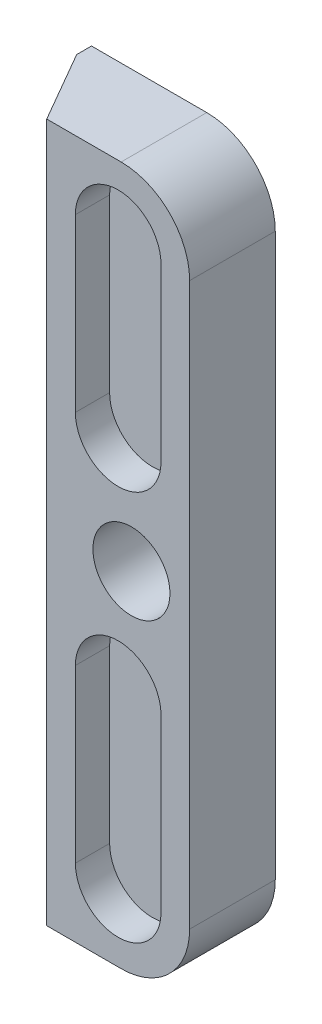
ISO-10303-21;
HEADER;
FILE_DESCRIPTION(('STEP AP214'),'2;1');
FILE_NAME('part.step','',(''),(''),'','','');
FILE_SCHEMA(('AUTOMOTIVE_DESIGN { 1 0 10303 214 1 1 1 1 }'));
ENDSEC;
DATA;
#1=APPLICATION_CONTEXT('core data for automotive mechanical design processes');
#2=APPLICATION_PROTOCOL_DEFINITION('international standard','automotive_design',2000,#1);
#3=PRODUCT_CONTEXT('',#1,'mechanical');
#4=PRODUCT('Part','Part','',(#3));
#5=PRODUCT_RELATED_PRODUCT_CATEGORY('part','',(#4));
#6=PRODUCT_DEFINITION_FORMATION('','',#4);
#7=PRODUCT_DEFINITION_CONTEXT('part definition',#1,'design');
#8=PRODUCT_DEFINITION('design','',#6,#7);
#9=PRODUCT_DEFINITION_SHAPE('','',#8);
#10=(LENGTH_UNIT() NAMED_UNIT(*) SI_UNIT(.MILLI.,.METRE.));
#11=(NAMED_UNIT(*) PLANE_ANGLE_UNIT() SI_UNIT($,.RADIAN.));
#12=(NAMED_UNIT(*) SI_UNIT($,.STERADIAN.) SOLID_ANGLE_UNIT());
#13=UNCERTAINTY_MEASURE_WITH_UNIT(LENGTH_MEASURE(1.E-05),#10,'distance_accuracy_value','');
#14=(GEOMETRIC_REPRESENTATION_CONTEXT(3) GLOBAL_UNCERTAINTY_ASSIGNED_CONTEXT((#13)) GLOBAL_UNIT_ASSIGNED_CONTEXT((#10,
#11,#12)) REPRESENTATION_CONTEXT('',''));
#15=CARTESIAN_POINT('',(0.,0.,0.));
#16=DIRECTION('',(0.,0.,1.));
#17=DIRECTION('',(1.,0.,0.));
#18=AXIS2_PLACEMENT_3D('',#15,#16,#17);
#19=CARTESIAN_POINT('',(0.,40.8,0.));
#20=DIRECTION('',(0.,0.,-1.));
#21=DIRECTION('',(-1.,0.,0.));
#22=AXIS2_PLACEMENT_3D('',#19,#20,#21);
#23=PLANE('',#22);
#24=CARTESIAN_POINT('',(-3.4,20.4,0.));
#25=DIRECTION('',(0.,0.,1.));
#26=DIRECTION('',(1.,0.,0.));
#27=AXIS2_PLACEMENT_3D('',#24,#25,#26);
#28=CIRCLE('',#27,2.24999999999999);
#29=CARTESIAN_POINT('',(-1.15000000000001,20.4,0.));
#30=VERTEX_POINT('',#29);
#31=EDGE_CURVE('E332',#30,#30,#28,.T.);
#32=ORIENTED_EDGE('',*,*,#31,.F.);
#33=EDGE_LOOP('',(#32));
#34=FACE_BOUND('',#33,.T.);
#35=DIRECTION('',(0.,1.,0.));
#36=VECTOR('',#35,1.);
#37=CARTESIAN_POINT('',(-1.67264973081037,4.,0.));
#38=LINE('',#37,#36);
#39=CARTESIAN_POINT('',(-1.67264973081037,4.,0.));
#40=VERTEX_POINT('',#39);
#41=CARTESIAN_POINT('',(-1.67264973081037,14.,0.));
#42=VERTEX_POINT('',#41);
#43=EDGE_CURVE('E160',#40,#42,#38,.T.);
#44=ORIENTED_EDGE('',*,*,#43,.F.);
#45=CARTESIAN_POINT('',(-4.17264973081037,4.,0.));
#46=DIRECTION('',(0.,0.,1.));
#47=DIRECTION('',(-1.,0.,0.));
#48=AXIS2_PLACEMENT_3D('',#45,#46,#47);
#49=CIRCLE('',#48,2.5);
#50=CARTESIAN_POINT('',(-6.67264973081037,4.,0.));
#51=VERTEX_POINT('',#50);
#52=EDGE_CURVE('E165',#51,#40,#49,.T.);
#53=ORIENTED_EDGE('',*,*,#52,.F.);
#54=DIRECTION('',(0.,-1.,0.));
#55=VECTOR('',#54,1.);
#56=CARTESIAN_POINT('',(-6.67264973081037,4.,0.));
#57=LINE('',#56,#55);
#58=CARTESIAN_POINT('',(-6.67264973081037,14.,0.));
#59=VERTEX_POINT('',#58);
#60=EDGE_CURVE('E169',#59,#51,#57,.T.);
#61=ORIENTED_EDGE('',*,*,#60,.F.);
#62=CARTESIAN_POINT('',(-4.17264973081038,14.,0.));
#63=DIRECTION('',(0.,0.,1.));
#64=DIRECTION('',(-1.,0.,0.));
#65=AXIS2_PLACEMENT_3D('',#62,#63,#64);
#66=CIRCLE('',#65,2.5);
#67=EDGE_CURVE('E149',#42,#59,#66,.T.);
#68=ORIENTED_EDGE('',*,*,#67,.F.);
#69=EDGE_LOOP('',(#44,#53,#61,#68));
#70=FACE_BOUND('',#69,.T.);
#71=DIRECTION('',(0.,-1.,0.));
#72=VECTOR('',#71,1.);
#73=CARTESIAN_POINT('',(-6.67264973081038,36.8,0.));
#74=LINE('',#73,#72);
#75=CARTESIAN_POINT('',(-6.67264973081038,36.8,0.));
#76=VERTEX_POINT('',#75);
#77=CARTESIAN_POINT('',(-6.67264973081037,26.8,0.));
#78=VERTEX_POINT('',#77);
#79=EDGE_CURVE('E191',#76,#78,#74,.T.);
#80=ORIENTED_EDGE('',*,*,#79,.F.);
#81=CARTESIAN_POINT('',(-4.17264973081038,36.8,0.));
#82=DIRECTION('',(0.,0.,1.));
#83=DIRECTION('',(1.,0.,0.));
#84=AXIS2_PLACEMENT_3D('',#81,#82,#83);
#85=CIRCLE('',#84,2.5);
#86=CARTESIAN_POINT('',(-1.67264973081037,36.8,0.));
#87=VERTEX_POINT('',#86);
#88=EDGE_CURVE('E180',#87,#76,#85,.T.);
#89=ORIENTED_EDGE('',*,*,#88,.F.);
#90=DIRECTION('',(0.,1.,0.));
#91=VECTOR('',#90,1.);
#92=CARTESIAN_POINT('',(-1.67264973081037,36.8,0.));
#93=LINE('',#92,#91);
#94=CARTESIAN_POINT('',(-1.67264973081038,26.8,0.));
#95=VERTEX_POINT('',#94);
#96=EDGE_CURVE('E197',#95,#87,#93,.T.);
#97=ORIENTED_EDGE('',*,*,#96,.F.);
#98=CARTESIAN_POINT('',(-4.17264973081038,26.8,0.));
#99=DIRECTION('',(0.,0.,1.));
#100=DIRECTION('',(1.,0.,0.));
#101=AXIS2_PLACEMENT_3D('',#98,#99,#100);
#102=CIRCLE('',#101,2.5);
#103=EDGE_CURVE('E194',#78,#95,#102,.T.);
#104=ORIENTED_EDGE('',*,*,#103,.F.);
#105=EDGE_LOOP('',(#80,#89,#97,#104));
#106=FACE_BOUND('',#105,.T.);
#107=DIRECTION('',(1.,0.,0.));
#108=VECTOR('',#107,1.);
#109=CARTESIAN_POINT('',(0.,0.,0.));
#110=LINE('',#109,#108);
#111=CARTESIAN_POINT('',(-8.34529946162075,0.,0.));
#112=VERTEX_POINT('',#111);
#113=CARTESIAN_POINT('',(-4.,0.,0.));
#114=VERTEX_POINT('',#113);
#115=EDGE_CURVE('E209',#112,#114,#110,.T.);
#116=ORIENTED_EDGE('',*,*,#115,.T.);
#117=CARTESIAN_POINT('',(-4.,4.,0.));
#118=DIRECTION('',(0.,0.,-1.));
#119=DIRECTION('',(-1.,0.,0.));
#120=AXIS2_PLACEMENT_3D('',#117,#118,#119);
#121=CIRCLE('',#120,4.);
#122=CARTESIAN_POINT('',(0.,4.,0.));
#123=VERTEX_POINT('',#122);
#124=EDGE_CURVE('E245',#114,#123,#121,.F.);
#125=ORIENTED_EDGE('',*,*,#124,.T.);
#126=DIRECTION('',(0.,-1.,0.));
#127=VECTOR('',#126,1.);
#128=CARTESIAN_POINT('',(0.,40.8,0.));
#129=LINE('',#128,#127);
#130=CARTESIAN_POINT('',(0.,36.8,0.));
#131=VERTEX_POINT('',#130);
#132=EDGE_CURVE('E229',#131,#123,#129,.T.);
#133=ORIENTED_EDGE('',*,*,#132,.F.);
#134=CARTESIAN_POINT('',(-4.,36.8,0.));
#135=DIRECTION('',(0.,0.,-1.));
#136=DIRECTION('',(-1.,0.,0.));
#137=AXIS2_PLACEMENT_3D('',#134,#135,#136);
#138=CIRCLE('',#137,4.);
#139=CARTESIAN_POINT('',(-4.,40.8,0.));
#140=VERTEX_POINT('',#139);
#141=EDGE_CURVE('E243',#131,#140,#138,.F.);
#142=ORIENTED_EDGE('',*,*,#141,.T.);
#143=DIRECTION('',(1.,0.,0.));
#144=VECTOR('',#143,1.);
#145=CARTESIAN_POINT('',(0.,40.8,0.));
#146=LINE('',#145,#144);
#147=CARTESIAN_POINT('',(-8.34529946162075,40.8,0.));
#148=VERTEX_POINT('',#147);
#149=EDGE_CURVE('E210',#148,#140,#146,.T.);
#150=ORIENTED_EDGE('',*,*,#149,.F.);
#151=DIRECTION('',(0.,-1.,0.));
#152=VECTOR('',#151,1.);
#153=CARTESIAN_POINT('',(-8.34529946162075,40.8,0.));
#154=LINE('',#153,#152);
#155=EDGE_CURVE('E218',#148,#112,#154,.T.);
#156=ORIENTED_EDGE('',*,*,#155,.T.);
#157=EDGE_LOOP('',(#116,#125,#133,#142,#150,#156));
#158=FACE_BOUND('',#157,.T.);
#159=ADVANCED_FACE('F37',(#34,#70,#106,#158),#23,.F.);
#160=CARTESIAN_POINT('',(0.,40.8,0.));
#161=DIRECTION('',(-1.,0.,0.));
#162=DIRECTION('',(0.,0.,1.));
#163=AXIS2_PLACEMENT_3D('',#160,#161,#162);
#164=PLANE('',#163);
#165=ORIENTED_EDGE('',*,*,#132,.T.);
#166=DIRECTION('',(0.,0.,-1.));
#167=VECTOR('',#166,1.);
#168=CARTESIAN_POINT('',(0.,4.,-5.));
#169=LINE('',#168,#167);
#170=CARTESIAN_POINT('',(0.,4.,-5.));
#171=VERTEX_POINT('',#170);
#172=EDGE_CURVE('E234',#123,#171,#169,.T.);
#173=ORIENTED_EDGE('',*,*,#172,.T.);
#174=DIRECTION('',(0.,-1.,0.));
#175=VECTOR('',#174,1.);
#176=CARTESIAN_POINT('',(0.,40.8,-5.));
#177=LINE('',#176,#175);
#178=CARTESIAN_POINT('',(0.,36.8,-5.));
#179=VERTEX_POINT('',#178);
#180=EDGE_CURVE('E226',#179,#171,#177,.T.);
#181=ORIENTED_EDGE('',*,*,#180,.F.);
#182=DIRECTION('',(0.,0.,-1.));
#183=VECTOR('',#182,1.);
#184=CARTESIAN_POINT('',(0.,36.8,0.));
#185=LINE('',#184,#183);
#186=EDGE_CURVE('E232',#179,#131,#185,.F.);
#187=ORIENTED_EDGE('',*,*,#186,.T.);
#188=EDGE_LOOP('',(#165,#173,#181,#187));
#189=FACE_BOUND('',#188,.T.);
#190=ADVANCED_FACE('F272',(#189),#164,.F.);
#191=CARTESIAN_POINT('',(0.,40.8,-5.));
#192=DIRECTION('',(0.,0.,1.));
#193=DIRECTION('',(1.,0.,0.));
#194=AXIS2_PLACEMENT_3D('',#191,#192,#193);
#195=PLANE('',#194);
#196=CARTESIAN_POINT('',(-3.4,20.4,-5.));
#197=DIRECTION('',(0.,0.,1.));
#198=DIRECTION('',(1.,0.,0.));
#199=AXIS2_PLACEMENT_3D('',#196,#197,#198);
#200=CIRCLE('',#199,2.25);
#201=CARTESIAN_POINT('',(-1.15,20.4,-5.));
#202=VERTEX_POINT('',#201);
#203=EDGE_CURVE('E331',#202,#202,#200,.T.);
#204=ORIENTED_EDGE('',*,*,#203,.T.);
#205=EDGE_LOOP('',(#204));
#206=FACE_BOUND('',#205,.T.);
#207=DIRECTION('',(-1.,0.,0.));
#208=VECTOR('',#207,1.);
#209=CARTESIAN_POINT('',(0.,0.,-5.));
#210=LINE('',#209,#208);
#211=CARTESIAN_POINT('',(-4.,0.,-5.));
#212=VERTEX_POINT('',#211);
#213=CARTESIAN_POINT('',(-10.7320508075689,0.,-5.));
#214=VERTEX_POINT('',#213);
#215=EDGE_CURVE('E221',#212,#214,#210,.T.);
#216=ORIENTED_EDGE('',*,*,#215,.T.);
#217=DIRECTION('',(0.,1.,0.));
#218=VECTOR('',#217,1.);
#219=CARTESIAN_POINT('',(-10.7320508075689,40.8,-5.));
#220=LINE('',#219,#218);
#221=CARTESIAN_POINT('',(-10.7320508075689,40.8,-5.));
#222=VERTEX_POINT('',#221);
#223=EDGE_CURVE('E45',#214,#222,#220,.T.);
#224=ORIENTED_EDGE('',*,*,#223,.T.);
#225=DIRECTION('',(-1.,0.,0.));
#226=VECTOR('',#225,1.);
#227=CARTESIAN_POINT('',(0.,40.8,-5.));
#228=LINE('',#227,#226);
#229=CARTESIAN_POINT('',(-4.,40.8,-5.));
#230=VERTEX_POINT('',#229);
#231=EDGE_CURVE('E213',#230,#222,#228,.T.);
#232=ORIENTED_EDGE('',*,*,#231,.F.);
#233=CARTESIAN_POINT('',(-4.,36.8,-5.));
#234=DIRECTION('',(0.,0.,1.));
#235=DIRECTION('',(1.,0.,0.));
#236=AXIS2_PLACEMENT_3D('',#233,#234,#235);
#237=CIRCLE('',#236,4.);
#238=EDGE_CURVE('E237',#230,#179,#237,.F.);
#239=ORIENTED_EDGE('',*,*,#238,.T.);
#240=ORIENTED_EDGE('',*,*,#180,.T.);
#241=CARTESIAN_POINT('',(-4.,4.,-5.));
#242=DIRECTION('',(0.,0.,1.));
#243=DIRECTION('',(1.,0.,0.));
#244=AXIS2_PLACEMENT_3D('',#241,#242,#243);
#245=CIRCLE('',#244,4.);
#246=EDGE_CURVE('E239',#171,#212,#245,.F.);
#247=ORIENTED_EDGE('',*,*,#246,.T.);
#248=EDGE_LOOP('',(#216,#224,#232,#239,#240,#247));
#249=FACE_BOUND('',#248,.T.);
#250=ADVANCED_FACE('F274',(#206,#249),#195,.F.);
#251=CARTESIAN_POINT('',(-8.34529946162075,40.8,0.));
#252=DIRECTION('',(0.86602540378444,0.,-0.499999999999998));
#253=DIRECTION('',(-0.499999999999998,0.,-0.86602540378444));
#254=AXIS2_PLACEMENT_3D('',#251,#252,#253);
#255=PLANE('',#254);
#256=DIRECTION('',(0.499999999999998,0.,0.86602540378444));
#257=VECTOR('',#256,1.);
#258=CARTESIAN_POINT('',(-8.34529946162075,40.8,0.));
#259=LINE('',#258,#257);
#260=CARTESIAN_POINT('',(-10.7320508075689,40.8,-4.13397459621556));
#261=VERTEX_POINT('',#260);
#262=EDGE_CURVE('E216',#261,#148,#259,.T.);
#263=ORIENTED_EDGE('',*,*,#262,.F.);
#264=DIRECTION('',(0.,-1.,0.));
#265=VECTOR('',#264,1.);
#266=CARTESIAN_POINT('',(-10.7320508075689,40.8,-4.13397459621556));
#267=LINE('',#266,#265);
#268=CARTESIAN_POINT('',(-10.7320508075689,0.,-4.13397459621556));
#269=VERTEX_POINT('',#268);
#270=EDGE_CURVE('E250',#261,#269,#267,.T.);
#271=ORIENTED_EDGE('',*,*,#270,.T.);
#272=DIRECTION('',(0.499999999999998,0.,0.86602540378444));
#273=VECTOR('',#272,1.);
#274=CARTESIAN_POINT('',(-8.34529946162075,0.,0.));
#275=LINE('',#274,#273);
#276=EDGE_CURVE('E214',#269,#112,#275,.T.);
#277=ORIENTED_EDGE('',*,*,#276,.T.);
#278=ORIENTED_EDGE('',*,*,#155,.F.);
#279=EDGE_LOOP('',(#263,#271,#277,#278));
#280=FACE_BOUND('',#279,.T.);
#281=ADVANCED_FACE('F256',(#280),#255,.F.);
#282=CARTESIAN_POINT('',(0.,40.8,0.));
#283=DIRECTION('',(0.,-1.,0.));
#284=DIRECTION('',(0.,0.,-1.));
#285=AXIS2_PLACEMENT_3D('',#282,#283,#284);
#286=PLANE('',#285);
#287=ORIENTED_EDGE('',*,*,#231,.T.);
#288=DIRECTION('',(0.,0.,-1.));
#289=VECTOR('',#288,1.);
#290=CARTESIAN_POINT('',(-10.7320508075689,40.8,-4.13397459621556));
#291=LINE('',#290,#289);
#292=EDGE_CURVE('E12',#222,#261,#291,.F.);
#293=ORIENTED_EDGE('',*,*,#292,.T.);
#294=ORIENTED_EDGE('',*,*,#262,.T.);
#295=ORIENTED_EDGE('',*,*,#149,.T.);
#296=DIRECTION('',(0.,0.,-1.));
#297=VECTOR('',#296,1.);
#298=CARTESIAN_POINT('',(-4.,40.8,0.));
#299=LINE('',#298,#297);
#300=EDGE_CURVE('E247',#140,#230,#299,.T.);
#301=ORIENTED_EDGE('',*,*,#300,.T.);
#302=EDGE_LOOP('',(#287,#293,#294,#295,#301));
#303=FACE_BOUND('',#302,.T.);
#304=ADVANCED_FACE('F280',(#303),#286,.F.);
#305=CARTESIAN_POINT('',(0.,0.,0.));
#306=DIRECTION('',(0.,-1.,0.));
#307=DIRECTION('',(0.,0.,-1.));
#308=AXIS2_PLACEMENT_3D('',#305,#306,#307);
#309=PLANE('',#308);
#310=ORIENTED_EDGE('',*,*,#276,.F.);
#311=DIRECTION('',(0.,0.,1.));
#312=VECTOR('',#311,1.);
#313=CARTESIAN_POINT('',(-10.7320508075689,0.,0.));
#314=LINE('',#313,#312);
#315=EDGE_CURVE('E59',#269,#214,#314,.F.);
#316=ORIENTED_EDGE('',*,*,#315,.T.);
#317=ORIENTED_EDGE('',*,*,#215,.F.);
#318=DIRECTION('',(0.,0.,-1.));
#319=VECTOR('',#318,1.);
#320=CARTESIAN_POINT('',(-4.,0.,0.));
#321=LINE('',#320,#319);
#322=EDGE_CURVE('E241',#212,#114,#321,.F.);
#323=ORIENTED_EDGE('',*,*,#322,.T.);
#324=ORIENTED_EDGE('',*,*,#115,.F.);
#325=EDGE_LOOP('',(#310,#316,#317,#323,#324));
#326=FACE_BOUND('',#325,.T.);
#327=ADVANCED_FACE('F261',(#326),#309,.T.);
#328=CARTESIAN_POINT('',(-4.,4.,0.));
#329=DIRECTION('',(0.,0.,1.));
#330=DIRECTION('',(1.,0.,0.));
#331=AXIS2_PLACEMENT_3D('',#328,#329,#330);
#332=CYLINDRICAL_SURFACE('',#331,4.);
#333=ORIENTED_EDGE('',*,*,#124,.F.);
#334=ORIENTED_EDGE('',*,*,#322,.F.);
#335=ORIENTED_EDGE('',*,*,#246,.F.);
#336=ORIENTED_EDGE('',*,*,#172,.F.);
#337=EDGE_LOOP('',(#333,#334,#335,#336));
#338=FACE_BOUND('',#337,.T.);
#339=ADVANCED_FACE('F269',(#338),#332,.T.);
#340=CARTESIAN_POINT('',(-4.,36.8,0.));
#341=DIRECTION('',(0.,0.,-1.));
#342=DIRECTION('',(-1.,0.,0.));
#343=AXIS2_PLACEMENT_3D('',#340,#341,#342);
#344=CYLINDRICAL_SURFACE('',#343,4.);
#345=ORIENTED_EDGE('',*,*,#141,.F.);
#346=ORIENTED_EDGE('',*,*,#186,.F.);
#347=ORIENTED_EDGE('',*,*,#238,.F.);
#348=ORIENTED_EDGE('',*,*,#300,.F.);
#349=EDGE_LOOP('',(#345,#346,#347,#348));
#350=FACE_BOUND('',#349,.T.);
#351=ADVANCED_FACE('F278',(#350),#344,.T.);
#352=CARTESIAN_POINT('',(-4.17264973081038,36.8,-20.8113883008419));
#353=DIRECTION('',(0.,0.,1.));
#354=DIRECTION('',(1.,0.,0.));
#355=AXIS2_PLACEMENT_3D('',#352,#353,#354);
#356=CYLINDRICAL_SURFACE('',#355,2.5);
#357=CARTESIAN_POINT('',(-4.17264973081038,36.8,-2.));
#358=DIRECTION('',(0.,0.,1.));
#359=DIRECTION('',(1.,0.,0.));
#360=AXIS2_PLACEMENT_3D('',#357,#358,#359);
#361=CIRCLE('',#360,2.5);
#362=CARTESIAN_POINT('',(-6.67264973081038,36.8,-2.));
#363=VERTEX_POINT('',#362);
#364=CARTESIAN_POINT('',(-1.67264973081037,36.8,-2.));
#365=VERTEX_POINT('',#364);
#366=EDGE_CURVE('E187',#363,#365,#361,.F.);
#367=ORIENTED_EDGE('',*,*,#366,.T.);
#368=DIRECTION('',(0.,0.,1.));
#369=VECTOR('',#368,1.);
#370=CARTESIAN_POINT('',(-1.67264973081037,36.8,-20.8113883008419));
#371=LINE('',#370,#369);
#372=EDGE_CURVE('E185',#365,#87,#371,.T.);
#373=ORIENTED_EDGE('',*,*,#372,.T.);
#374=ORIENTED_EDGE('',*,*,#88,.T.);
#375=DIRECTION('',(0.,0.,1.));
#376=VECTOR('',#375,1.);
#377=CARTESIAN_POINT('',(-6.67264973081038,36.8,-20.8113883008419));
#378=LINE('',#377,#376);
#379=EDGE_CURVE('E200',#363,#76,#378,.T.);
#380=ORIENTED_EDGE('',*,*,#379,.F.);
#381=EDGE_LOOP('',(#367,#373,#374,#380));
#382=FACE_BOUND('',#381,.T.);
#383=ADVANCED_FACE('F303',(#382),#356,.F.);
#384=CARTESIAN_POINT('',(-1.67264973081037,36.8,-20.8113883008419));
#385=DIRECTION('',(1.,0.,0.));
#386=DIRECTION('',(0.,1.,0.));
#387=AXIS2_PLACEMENT_3D('',#384,#385,#386);
#388=PLANE('',#387);
#389=DIRECTION('',(0.,-1.,0.));
#390=VECTOR('',#389,1.);
#391=CARTESIAN_POINT('',(-1.67264973081037,36.8,-2.));
#392=LINE('',#391,#390);
#393=CARTESIAN_POINT('',(-1.67264973081038,26.8,-2.));
#394=VERTEX_POINT('',#393);
#395=EDGE_CURVE('E184',#365,#394,#392,.T.);
#396=ORIENTED_EDGE('',*,*,#395,.T.);
#397=DIRECTION('',(0.,0.,1.));
#398=VECTOR('',#397,1.);
#399=CARTESIAN_POINT('',(-1.67264973081038,26.8,-20.8113883008419));
#400=LINE('',#399,#398);
#401=EDGE_CURVE('E202',#394,#95,#400,.T.);
#402=ORIENTED_EDGE('',*,*,#401,.T.);
#403=ORIENTED_EDGE('',*,*,#96,.T.);
#404=ORIENTED_EDGE('',*,*,#372,.F.);
#405=EDGE_LOOP('',(#396,#402,#403,#404));
#406=FACE_BOUND('',#405,.T.);
#407=ADVANCED_FACE('F307',(#406),#388,.F.);
#408=CARTESIAN_POINT('',(-4.17264973081038,26.8,-20.8113883008419));
#409=DIRECTION('',(0.,0.,1.));
#410=DIRECTION('',(1.,0.,0.));
#411=AXIS2_PLACEMENT_3D('',#408,#409,#410);
#412=CYLINDRICAL_SURFACE('',#411,2.5);
#413=CARTESIAN_POINT('',(-4.17264973081038,26.8,-2.));
#414=DIRECTION('',(0.,0.,1.));
#415=DIRECTION('',(1.,0.,0.));
#416=AXIS2_PLACEMENT_3D('',#413,#414,#415);
#417=CIRCLE('',#416,2.5);
#418=CARTESIAN_POINT('',(-6.67264973081037,26.8,-2.));
#419=VERTEX_POINT('',#418);
#420=EDGE_CURVE('E182',#394,#419,#417,.F.);
#421=ORIENTED_EDGE('',*,*,#420,.T.);
#422=DIRECTION('',(0.,0.,1.));
#423=VECTOR('',#422,1.);
#424=CARTESIAN_POINT('',(-6.67264973081037,26.8,-20.8113883008419));
#425=LINE('',#424,#423);
#426=EDGE_CURVE('E204',#419,#78,#425,.T.);
#427=ORIENTED_EDGE('',*,*,#426,.T.);
#428=ORIENTED_EDGE('',*,*,#103,.T.);
#429=ORIENTED_EDGE('',*,*,#401,.F.);
#430=EDGE_LOOP('',(#421,#427,#428,#429));
#431=FACE_BOUND('',#430,.T.);
#432=ADVANCED_FACE('F313',(#431),#412,.F.);
#433=CARTESIAN_POINT('',(-6.67264973081038,36.8,-20.8113883008419));
#434=DIRECTION('',(-1.,0.,0.));
#435=DIRECTION('',(0.,-1.,0.));
#436=AXIS2_PLACEMENT_3D('',#433,#434,#435);
#437=PLANE('',#436);
#438=DIRECTION('',(0.,1.,0.));
#439=VECTOR('',#438,1.);
#440=CARTESIAN_POINT('',(-6.67264973081038,36.8,-2.));
#441=LINE('',#440,#439);
#442=EDGE_CURVE('E189',#419,#363,#441,.T.);
#443=ORIENTED_EDGE('',*,*,#442,.T.);
#444=ORIENTED_EDGE('',*,*,#379,.T.);
#445=ORIENTED_EDGE('',*,*,#79,.T.);
#446=ORIENTED_EDGE('',*,*,#426,.F.);
#447=EDGE_LOOP('',(#443,#444,#445,#446));
#448=FACE_BOUND('',#447,.T.);
#449=ADVANCED_FACE('F318',(#448),#437,.F.);
#450=CARTESIAN_POINT('',(0.,40.8,-2.));
#451=DIRECTION('',(0.,0.,1.));
#452=DIRECTION('',(1.,0.,0.));
#453=AXIS2_PLACEMENT_3D('',#450,#451,#452);
#454=PLANE('',#453);
#455=ORIENTED_EDGE('',*,*,#366,.F.);
#456=ORIENTED_EDGE('',*,*,#442,.F.);
#457=ORIENTED_EDGE('',*,*,#420,.F.);
#458=ORIENTED_EDGE('',*,*,#395,.F.);
#459=EDGE_LOOP('',(#455,#456,#457,#458));
#460=FACE_BOUND('',#459,.T.);
#461=ADVANCED_FACE('F355',(#460),#454,.T.);
#462=CARTESIAN_POINT('',(-4.17264973081037,4.,-20.8113883008419));
#463=DIRECTION('',(0.,0.,1.));
#464=DIRECTION('',(1.,0.,0.));
#465=AXIS2_PLACEMENT_3D('',#462,#463,#464);
#466=CYLINDRICAL_SURFACE('',#465,2.5);
#467=CARTESIAN_POINT('',(-4.17264973081037,4.,-2.));
#468=DIRECTION('',(0.,0.,1.));
#469=DIRECTION('',(1.,0.,0.));
#470=AXIS2_PLACEMENT_3D('',#467,#468,#469);
#471=CIRCLE('',#470,2.5);
#472=CARTESIAN_POINT('',(-1.67264973081037,4.,-2.));
#473=VERTEX_POINT('',#472);
#474=CARTESIAN_POINT('',(-6.67264973081037,4.,-2.));
#475=VERTEX_POINT('',#474);
#476=EDGE_CURVE('E181',#473,#475,#471,.F.);
#477=ORIENTED_EDGE('',*,*,#476,.T.);
#478=DIRECTION('',(0.,0.,1.));
#479=VECTOR('',#478,1.);
#480=CARTESIAN_POINT('',(-6.67264973081037,4.,-20.8113883008419));
#481=LINE('',#480,#479);
#482=EDGE_CURVE('E174',#475,#51,#481,.T.);
#483=ORIENTED_EDGE('',*,*,#482,.T.);
#484=ORIENTED_EDGE('',*,*,#52,.T.);
#485=DIRECTION('',(0.,0.,1.));
#486=VECTOR('',#485,1.);
#487=CARTESIAN_POINT('',(-1.67264973081037,4.,-20.8113883008419));
#488=LINE('',#487,#486);
#489=EDGE_CURVE('E156',#473,#40,#488,.T.);
#490=ORIENTED_EDGE('',*,*,#489,.F.);
#491=EDGE_LOOP('',(#477,#483,#484,#490));
#492=FACE_BOUND('',#491,.T.);
#493=ADVANCED_FACE('F343',(#492),#466,.F.);
#494=CARTESIAN_POINT('',(-6.67264973081037,4.,-20.8113883008419));
#495=DIRECTION('',(-1.,0.,0.));
#496=DIRECTION('',(0.,-1.,0.));
#497=AXIS2_PLACEMENT_3D('',#494,#495,#496);
#498=PLANE('',#497);
#499=DIRECTION('',(0.,1.,0.));
#500=VECTOR('',#499,1.);
#501=CARTESIAN_POINT('',(-6.67264973081037,4.,-2.));
#502=LINE('',#501,#500);
#503=CARTESIAN_POINT('',(-6.67264973081037,14.,-2.));
#504=VERTEX_POINT('',#503);
#505=EDGE_CURVE('E338',#475,#504,#502,.T.);
#506=ORIENTED_EDGE('',*,*,#505,.T.);
#507=DIRECTION('',(0.,0.,1.));
#508=VECTOR('',#507,1.);
#509=CARTESIAN_POINT('',(-6.67264973081037,14.,-20.8113883008419));
#510=LINE('',#509,#508);
#511=EDGE_CURVE('E155',#504,#59,#510,.T.);
#512=ORIENTED_EDGE('',*,*,#511,.T.);
#513=ORIENTED_EDGE('',*,*,#60,.T.);
#514=ORIENTED_EDGE('',*,*,#482,.F.);
#515=EDGE_LOOP('',(#506,#512,#513,#514));
#516=FACE_BOUND('',#515,.T.);
#517=ADVANCED_FACE('F347',(#516),#498,.F.);
#518=CARTESIAN_POINT('',(-4.17264973081038,14.,-20.8113883008419));
#519=DIRECTION('',(0.,0.,1.));
#520=DIRECTION('',(1.,0.,0.));
#521=AXIS2_PLACEMENT_3D('',#518,#519,#520);
#522=CYLINDRICAL_SURFACE('',#521,2.5);
#523=CARTESIAN_POINT('',(-4.17264973081038,14.,-2.));
#524=DIRECTION('',(0.,0.,1.));
#525=DIRECTION('',(1.,0.,0.));
#526=AXIS2_PLACEMENT_3D('',#523,#524,#525);
#527=CIRCLE('',#526,2.5);
#528=CARTESIAN_POINT('',(-1.67264973081037,14.,-2.));
#529=VERTEX_POINT('',#528);
#530=EDGE_CURVE('E152',#504,#529,#527,.F.);
#531=ORIENTED_EDGE('',*,*,#530,.T.);
#532=DIRECTION('',(0.,0.,1.));
#533=VECTOR('',#532,1.);
#534=CARTESIAN_POINT('',(-1.67264973081037,14.,-20.8113883008419));
#535=LINE('',#534,#533);
#536=EDGE_CURVE('E144',#529,#42,#535,.T.);
#537=ORIENTED_EDGE('',*,*,#536,.T.);
#538=ORIENTED_EDGE('',*,*,#67,.T.);
#539=ORIENTED_EDGE('',*,*,#511,.F.);
#540=EDGE_LOOP('',(#531,#537,#538,#539));
#541=FACE_BOUND('',#540,.T.);
#542=ADVANCED_FACE('F146',(#541),#522,.F.);
#543=CARTESIAN_POINT('',(-1.67264973081037,4.,-20.8113883008419));
#544=DIRECTION('',(1.,0.,0.));
#545=DIRECTION('',(0.,1.,0.));
#546=AXIS2_PLACEMENT_3D('',#543,#544,#545);
#547=PLANE('',#546);
#548=DIRECTION('',(0.,-1.,0.));
#549=VECTOR('',#548,1.);
#550=CARTESIAN_POINT('',(-1.67264973081037,4.,-2.));
#551=LINE('',#550,#549);
#552=EDGE_CURVE('E178',#529,#473,#551,.T.);
#553=ORIENTED_EDGE('',*,*,#552,.T.);
#554=ORIENTED_EDGE('',*,*,#489,.T.);
#555=ORIENTED_EDGE('',*,*,#43,.T.);
#556=ORIENTED_EDGE('',*,*,#536,.F.);
#557=EDGE_LOOP('',(#553,#554,#555,#556));
#558=FACE_BOUND('',#557,.T.);
#559=ADVANCED_FACE('F161',(#558),#547,.F.);
#560=CARTESIAN_POINT('',(0.,40.8,-2.));
#561=DIRECTION('',(0.,0.,1.));
#562=DIRECTION('',(1.,0.,0.));
#563=AXIS2_PLACEMENT_3D('',#560,#561,#562);
#564=PLANE('',#563);
#565=ORIENTED_EDGE('',*,*,#476,.F.);
#566=ORIENTED_EDGE('',*,*,#552,.F.);
#567=ORIENTED_EDGE('',*,*,#530,.F.);
#568=ORIENTED_EDGE('',*,*,#505,.F.);
#569=EDGE_LOOP('',(#565,#566,#567,#568));
#570=FACE_BOUND('',#569,.T.);
#571=ADVANCED_FACE('F286',(#570),#564,.T.);
#572=CARTESIAN_POINT('',(-3.4,20.4,0.));
#573=DIRECTION('',(0.,0.,1.));
#574=DIRECTION('',(1.,0.,0.));
#575=AXIS2_PLACEMENT_3D('',#572,#573,#574);
#576=CYLINDRICAL_SURFACE('',#575,2.24999999999999);
#577=ORIENTED_EDGE('',*,*,#203,.F.);
#578=EDGE_LOOP('',(#577));
#579=FACE_BOUND('',#578,.T.);
#580=ORIENTED_EDGE('',*,*,#31,.T.);
#581=EDGE_LOOP('',(#580));
#582=FACE_BOUND('',#581,.T.);
#583=ADVANCED_FACE('F282',(#579,#582),#576,.F.);
#584=CARTESIAN_POINT('',(-10.7320508075689,40.8,-4.13397459621556));
#585=DIRECTION('',(1.,0.,0.));
#586=DIRECTION('',(0.,-1.,0.));
#587=AXIS2_PLACEMENT_3D('',#584,#585,#586);
#588=PLANE('',#587);
#589=ORIENTED_EDGE('',*,*,#292,.F.);
#590=ORIENTED_EDGE('',*,*,#223,.F.);
#591=ORIENTED_EDGE('',*,*,#315,.F.);
#592=ORIENTED_EDGE('',*,*,#270,.F.);
#593=EDGE_LOOP('',(#589,#590,#591,#592));
#594=FACE_BOUND('',#593,.T.);
#595=ADVANCED_FACE('F39',(#594),#588,.F.);
#596=CLOSED_SHELL('',(#159,#190,#250,#281,#304,#327,#339,#351,#383,#407,#432,#449,#461,#493,
#517,#542,#559,#571,#583,#595));
#597=MANIFOLD_SOLID_BREP('B2',#596);
#598=ADVANCED_BREP_SHAPE_REPRESENTATION('',(#18,#597),#14);
#599=SHAPE_DEFINITION_REPRESENTATION(#9,#598);
ENDSEC;
END-ISO-10303-21;
